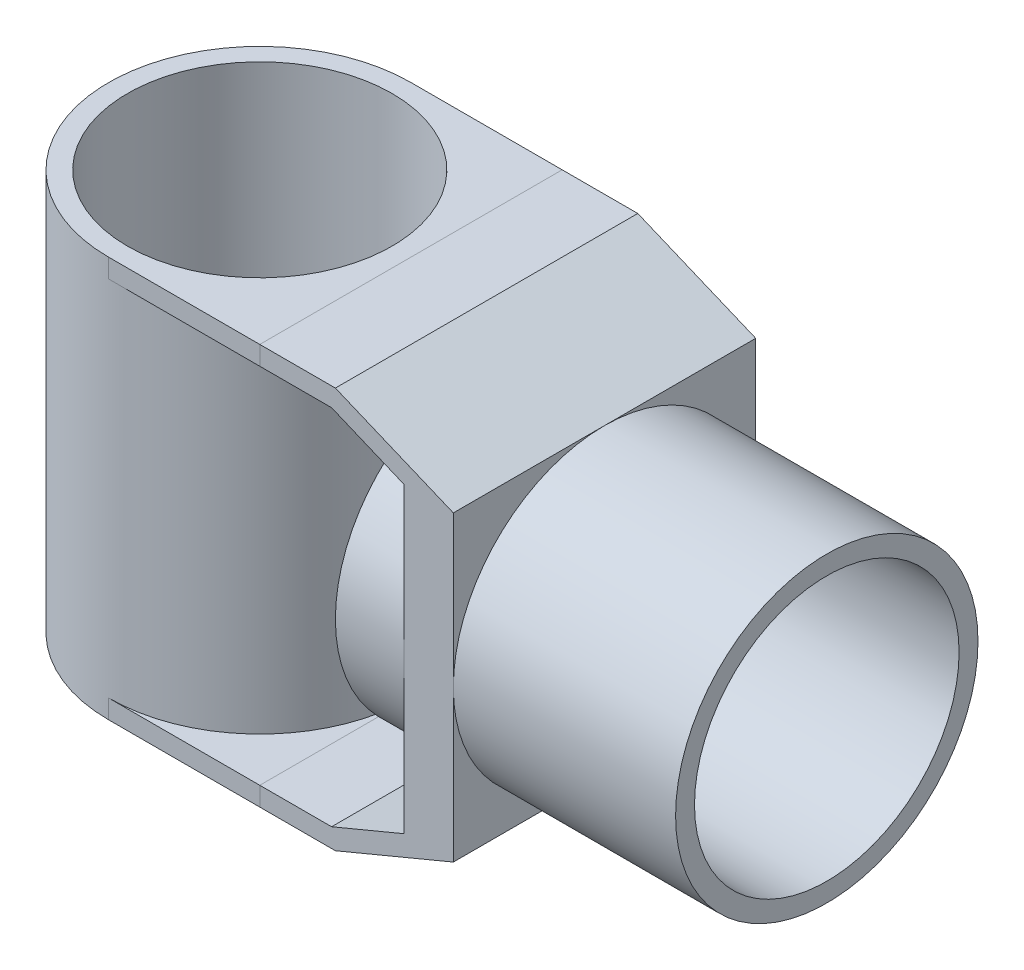
ISO-10303-21;
HEADER;
FILE_DESCRIPTION(('STEP AP214'),'2;1');
FILE_NAME('part.step','',(''),(''),'','','');
FILE_SCHEMA(('AUTOMOTIVE_DESIGN { 1 0 10303 214 1 1 1 1 }'));
ENDSEC;
DATA;
#1=APPLICATION_CONTEXT('core data for automotive mechanical design processes');
#2=APPLICATION_PROTOCOL_DEFINITION('international standard','automotive_design',2000,#1);
#3=PRODUCT_CONTEXT('',#1,'mechanical');
#4=PRODUCT('Part','Part','',(#3));
#5=PRODUCT_RELATED_PRODUCT_CATEGORY('part','',(#4));
#6=PRODUCT_DEFINITION_FORMATION('','',#4);
#7=PRODUCT_DEFINITION_CONTEXT('part definition',#1,'design');
#8=PRODUCT_DEFINITION('design','',#6,#7);
#9=PRODUCT_DEFINITION_SHAPE('','',#8);
#10=(LENGTH_UNIT() NAMED_UNIT(*) SI_UNIT(.MILLI.,.METRE.));
#11=(NAMED_UNIT(*) PLANE_ANGLE_UNIT() SI_UNIT($,.RADIAN.));
#12=(NAMED_UNIT(*) SI_UNIT($,.STERADIAN.) SOLID_ANGLE_UNIT());
#13=UNCERTAINTY_MEASURE_WITH_UNIT(LENGTH_MEASURE(1.E-05),#10,'distance_accuracy_value','');
#14=(GEOMETRIC_REPRESENTATION_CONTEXT(3) GLOBAL_UNCERTAINTY_ASSIGNED_CONTEXT((#13)) GLOBAL_UNIT_ASSIGNED_CONTEXT((#10,
#11,#12)) REPRESENTATION_CONTEXT('',''));
#15=CARTESIAN_POINT('',(0.,0.,0.));
#16=DIRECTION('',(0.,0.,1.));
#17=DIRECTION('',(1.,0.,0.));
#18=AXIS2_PLACEMENT_3D('',#15,#16,#17);
#19=CARTESIAN_POINT('',(180.,0.,0.));
#20=DIRECTION('',(-1.,0.,0.));
#21=DIRECTION('',(0.,0.,1.));
#22=AXIS2_PLACEMENT_3D('',#19,#20,#21);
#23=CYLINDRICAL_SURFACE('',#22,80.);
#24=CARTESIAN_POINT('',(0.,0.,0.));
#25=DIRECTION('',(-1.,0.,0.));
#26=DIRECTION('',(0.,0.,1.));
#27=AXIS2_PLACEMENT_3D('',#24,#25,#26);
#28=CIRCLE('',#27,80.);
#29=CARTESIAN_POINT('',(0.,0.,80.));
#30=VERTEX_POINT('',#29);
#31=EDGE_CURVE('E295',#30,#30,#28,.T.);
#32=ORIENTED_EDGE('',*,*,#31,.F.);
#33=EDGE_LOOP('',(#32));
#34=FACE_BOUND('',#33,.T.);
#35=CARTESIAN_POINT('',(36.4000000000002,0.,0.));
#36=DIRECTION('',(1.,0.,0.));
#37=DIRECTION('',(0.,1.,0.));
#38=AXIS2_PLACEMENT_3D('',#35,#36,#37);
#39=CIRCLE('',#38,80.);
#40=CARTESIAN_POINT('',(36.4000000000002,80.,0.));
#41=VERTEX_POINT('',#40);
#42=CARTESIAN_POINT('',(36.4000000000002,0.,80.));
#43=VERTEX_POINT('',#42);
#44=EDGE_CURVE('E189',#41,#43,#39,.T.);
#45=ORIENTED_EDGE('',*,*,#44,.F.);
#46=CARTESIAN_POINT('',(36.4000000000002,0.,0.));
#47=DIRECTION('',(1.,0.,0.));
#48=DIRECTION('',(0.,1.,0.));
#49=AXIS2_PLACEMENT_3D('',#46,#47,#48);
#50=CIRCLE('',#49,80.);
#51=CARTESIAN_POINT('',(36.4000000000002,0.,-80.));
#52=VERTEX_POINT('',#51);
#53=EDGE_CURVE('E182',#52,#41,#50,.T.);
#54=ORIENTED_EDGE('',*,*,#53,.F.);
#55=CARTESIAN_POINT('',(36.4000000000002,0.,0.));
#56=DIRECTION('',(1.,0.,0.));
#57=DIRECTION('',(0.,0.,-1.));
#58=AXIS2_PLACEMENT_3D('',#55,#56,#57);
#59=CIRCLE('',#58,80.);
#60=CARTESIAN_POINT('',(36.4000000000002,-80.,0.));
#61=VERTEX_POINT('',#60);
#62=EDGE_CURVE('E286',#61,#52,#59,.T.);
#63=ORIENTED_EDGE('',*,*,#62,.F.);
#64=CARTESIAN_POINT('',(36.4000000000002,0.,0.));
#65=DIRECTION('',(1.,0.,0.));
#66=DIRECTION('',(0.,0.,-1.));
#67=AXIS2_PLACEMENT_3D('',#64,#65,#66);
#68=CIRCLE('',#67,80.);
#69=EDGE_CURVE('E566',#43,#61,#68,.T.);
#70=ORIENTED_EDGE('',*,*,#69,.F.);
#71=EDGE_LOOP('',(#45,#54,#63,#70));
#72=FACE_BOUND('',#71,.T.);
#73=ADVANCED_FACE('F46',(#34,#72),#23,.T.);
#74=CARTESIAN_POINT('',(180.,0.,0.));
#75=DIRECTION('',(-1.,0.,0.));
#76=DIRECTION('',(0.,0.,1.));
#77=AXIS2_PLACEMENT_3D('',#74,#75,#76);
#78=CIRCLE('',#77,80.);
#79=CARTESIAN_POINT('',(180.,0.,80.));
#80=VERTEX_POINT('',#79);
#81=EDGE_CURVE('E298',#80,#80,#78,.T.);
#82=ORIENTED_EDGE('',*,*,#81,.T.);
#83=EDGE_LOOP('',(#82));
#84=FACE_BOUND('',#83,.T.);
#85=CARTESIAN_POINT('',(62.4000000000003,0.,0.));
#86=DIRECTION('',(-1.,0.,0.));
#87=DIRECTION('',(0.,0.,1.));
#88=AXIS2_PLACEMENT_3D('',#85,#86,#87);
#89=CIRCLE('',#88,80.);
#90=CARTESIAN_POINT('',(62.4000000000003,0.,-80.));
#91=VERTEX_POINT('',#90);
#92=CARTESIAN_POINT('',(62.4000000000003,-80.,0.));
#93=VERTEX_POINT('',#92);
#94=EDGE_CURVE('E279',#91,#93,#89,.T.);
#95=ORIENTED_EDGE('',*,*,#94,.F.);
#96=CARTESIAN_POINT('',(62.4000000000003,0.,0.));
#97=DIRECTION('',(-1.,0.,0.));
#98=DIRECTION('',(0.,-1.,0.));
#99=AXIS2_PLACEMENT_3D('',#96,#97,#98);
#100=CIRCLE('',#99,80.);
#101=CARTESIAN_POINT('',(62.4000000000003,80.,0.));
#102=VERTEX_POINT('',#101);
#103=EDGE_CURVE('E176',#102,#91,#100,.T.);
#104=ORIENTED_EDGE('',*,*,#103,.F.);
#105=CARTESIAN_POINT('',(62.4000000000003,0.,0.));
#106=DIRECTION('',(-1.,0.,0.));
#107=DIRECTION('',(0.,-1.,0.));
#108=AXIS2_PLACEMENT_3D('',#105,#106,#107);
#109=CIRCLE('',#108,80.);
#110=CARTESIAN_POINT('',(62.4000000000003,0.,80.));
#111=VERTEX_POINT('',#110);
#112=EDGE_CURVE('E116',#111,#102,#109,.T.);
#113=ORIENTED_EDGE('',*,*,#112,.F.);
#114=CARTESIAN_POINT('',(62.4000000000003,0.,0.));
#115=DIRECTION('',(-1.,0.,0.));
#116=DIRECTION('',(0.,0.,1.));
#117=AXIS2_PLACEMENT_3D('',#114,#115,#116);
#118=CIRCLE('',#117,80.);
#119=EDGE_CURVE('E244',#93,#111,#118,.T.);
#120=ORIENTED_EDGE('',*,*,#119,.F.);
#121=EDGE_LOOP('',(#95,#104,#113,#120));
#122=FACE_BOUND('',#121,.T.);
#123=ADVANCED_FACE('F318',(#84,#122),#23,.T.);
#124=CARTESIAN_POINT('',(-40.,106.,80.));
#125=DIRECTION('',(1.,0.,0.));
#126=DIRECTION('',(0.,0.,-1.));
#127=AXIS2_PLACEMENT_3D('',#124,#125,#126);
#128=PLANE('',#127);
#129=DIRECTION('',(0.,-1.,0.));
#130=VECTOR('',#129,1.);
#131=CARTESIAN_POINT('',(-40.,106.,-80.));
#132=LINE('',#131,#130);
#133=CARTESIAN_POINT('',(-40.,106.,-80.));
#134=VERTEX_POINT('',#133);
#135=CARTESIAN_POINT('',(-40.,96.,-80.));
#136=VERTEX_POINT('',#135);
#137=EDGE_CURVE('E140',#134,#136,#132,.T.);
#138=ORIENTED_EDGE('',*,*,#137,.T.);
#139=DIRECTION('',(0.,0.,-1.));
#140=VECTOR('',#139,1.);
#141=CARTESIAN_POINT('',(-40.,96.,80.));
#142=LINE('',#141,#140);
#143=CARTESIAN_POINT('',(-40.,96.,80.));
#144=VERTEX_POINT('',#143);
#145=EDGE_CURVE('E12',#144,#136,#142,.T.);
#146=ORIENTED_EDGE('',*,*,#145,.F.);
#147=DIRECTION('',(0.,-1.,0.));
#148=VECTOR('',#147,1.);
#149=CARTESIAN_POINT('',(-40.,106.,80.));
#150=LINE('',#149,#148);
#151=CARTESIAN_POINT('',(-40.,106.,80.));
#152=VERTEX_POINT('',#151);
#153=EDGE_CURVE('E149',#152,#144,#150,.T.);
#154=ORIENTED_EDGE('',*,*,#153,.F.);
#155=DIRECTION('',(0.,0.,-1.));
#156=VECTOR('',#155,1.);
#157=CARTESIAN_POINT('',(-40.,106.,80.));
#158=LINE('',#157,#156);
#159=EDGE_CURVE('E134',#152,#134,#158,.T.);
#160=ORIENTED_EDGE('',*,*,#159,.T.);
#161=EDGE_LOOP('',(#138,#146,#154,#160));
#162=FACE_BOUND('',#161,.T.);
#163=ADVANCED_FACE('F48',(#162),#128,.F.);
#164=CARTESIAN_POINT('',(-40.,96.,80.));
#165=DIRECTION('',(0.,1.,0.));
#166=DIRECTION('',(0.,0.,1.));
#167=AXIS2_PLACEMENT_3D('',#164,#165,#166);
#168=PLANE('',#167);
#169=DIRECTION('',(1.,0.,0.));
#170=VECTOR('',#169,1.);
#171=CARTESIAN_POINT('',(-40.,96.,-80.));
#172=LINE('',#171,#170);
#173=CARTESIAN_POINT('',(-1.99999999999999,96.,-80.));
#174=VERTEX_POINT('',#173);
#175=EDGE_CURVE('E143',#136,#174,#172,.T.);
#176=ORIENTED_EDGE('',*,*,#175,.T.);
#177=DIRECTION('',(0.,0.,-1.));
#178=VECTOR('',#177,1.);
#179=CARTESIAN_POINT('',(-1.99999999999999,96.,80.));
#180=LINE('',#179,#178);
#181=CARTESIAN_POINT('',(-1.99999999999999,96.,80.));
#182=VERTEX_POINT('',#181);
#183=EDGE_CURVE('E55',#182,#174,#180,.T.);
#184=ORIENTED_EDGE('',*,*,#183,.F.);
#185=DIRECTION('',(1.,0.,0.));
#186=VECTOR('',#185,1.);
#187=CARTESIAN_POINT('',(-40.,96.,80.));
#188=LINE('',#187,#186);
#189=EDGE_CURVE('E100',#144,#182,#188,.T.);
#190=ORIENTED_EDGE('',*,*,#189,.F.);
#191=ORIENTED_EDGE('',*,*,#145,.T.);
#192=EDGE_LOOP('',(#176,#184,#190,#191));
#193=FACE_BOUND('',#192,.T.);
#194=ADVANCED_FACE('F311',(#193),#168,.F.);
#195=CARTESIAN_POINT('',(-1.99999999999999,96.,80.));
#196=DIRECTION('',(0.384615384615383,0.923076923076924,0.));
#197=DIRECTION('',(-0.923076923076924,0.384615384615383,0.));
#198=AXIS2_PLACEMENT_3D('',#195,#196,#197);
#199=PLANE('',#198);
#200=DIRECTION('',(0.923076923076924,-0.384615384615384,0.));
#201=VECTOR('',#200,1.);
#202=CARTESIAN_POINT('',(-1.99999999999999,96.,-80.));
#203=LINE('',#202,#201);
#204=CARTESIAN_POINT('',(36.4000000000002,80.,-80.));
#205=VERTEX_POINT('',#204);
#206=EDGE_CURVE('E145',#174,#205,#203,.T.);
#207=ORIENTED_EDGE('',*,*,#206,.T.);
#208=DIRECTION('',(0.,0.,-1.));
#209=VECTOR('',#208,1.);
#210=CARTESIAN_POINT('',(36.4000000000002,80.,80.));
#211=LINE('',#210,#209);
#212=EDGE_CURVE('E119',#41,#205,#211,.T.);
#213=ORIENTED_EDGE('',*,*,#212,.F.);
#214=CARTESIAN_POINT('',(36.4000000000002,80.,80.));
#215=VERTEX_POINT('',#214);
#216=EDGE_CURVE('E152',#215,#41,#211,.T.);
#217=ORIENTED_EDGE('',*,*,#216,.F.);
#218=DIRECTION('',(0.923076923076924,-0.384615384615384,0.));
#219=VECTOR('',#218,1.);
#220=CARTESIAN_POINT('',(-1.99999999999999,96.,80.));
#221=LINE('',#220,#219);
#222=EDGE_CURVE('E132',#182,#215,#221,.T.);
#223=ORIENTED_EDGE('',*,*,#222,.F.);
#224=ORIENTED_EDGE('',*,*,#183,.T.);
#225=EDGE_LOOP('',(#207,#213,#217,#223,#224));
#226=FACE_BOUND('',#225,.T.);
#227=ADVANCED_FACE('F158',(#226),#199,.F.);
#228=CARTESIAN_POINT('',(0.,106.,80.));
#229=DIRECTION('',(-0.384615384615384,-0.923076923076923,0.));
#230=DIRECTION('',(0.923076923076924,-0.384615384615384,0.));
#231=AXIS2_PLACEMENT_3D('',#228,#229,#230);
#232=PLANE('',#231);
#233=DIRECTION('',(-0.923076923076923,0.384615384615384,0.));
#234=VECTOR('',#233,1.);
#235=CARTESIAN_POINT('',(0.,106.,-80.));
#236=LINE('',#235,#234);
#237=CARTESIAN_POINT('',(62.4000000000003,80.,-80.));
#238=VERTEX_POINT('',#237);
#239=CARTESIAN_POINT('',(0.,106.,-80.));
#240=VERTEX_POINT('',#239);
#241=EDGE_CURVE('E86',#238,#240,#236,.T.);
#242=ORIENTED_EDGE('',*,*,#241,.T.);
#243=DIRECTION('',(0.,0.,-1.));
#244=VECTOR('',#243,1.);
#245=CARTESIAN_POINT('',(0.,106.,80.));
#246=LINE('',#245,#244);
#247=CARTESIAN_POINT('',(0.,106.,80.));
#248=VERTEX_POINT('',#247);
#249=EDGE_CURVE('E131',#248,#240,#246,.T.);
#250=ORIENTED_EDGE('',*,*,#249,.F.);
#251=DIRECTION('',(-0.923076923076923,0.384615384615384,0.));
#252=VECTOR('',#251,1.);
#253=CARTESIAN_POINT('',(0.,106.,80.));
#254=LINE('',#253,#252);
#255=CARTESIAN_POINT('',(62.4000000000003,80.,80.));
#256=VERTEX_POINT('',#255);
#257=EDGE_CURVE('E124',#256,#248,#254,.T.);
#258=ORIENTED_EDGE('',*,*,#257,.F.);
#259=DIRECTION('',(0.,0.,-1.));
#260=VECTOR('',#259,1.);
#261=CARTESIAN_POINT('',(62.4000000000003,80.,80.));
#262=LINE('',#261,#260);
#263=EDGE_CURVE('E109',#256,#102,#262,.T.);
#264=ORIENTED_EDGE('',*,*,#263,.T.);
#265=EDGE_CURVE('E120',#102,#238,#262,.T.);
#266=ORIENTED_EDGE('',*,*,#265,.T.);
#267=EDGE_LOOP('',(#242,#250,#258,#264,#266));
#268=FACE_BOUND('',#267,.T.);
#269=ADVANCED_FACE('F130',(#268),#232,.F.);
#270=CARTESIAN_POINT('',(-40.,106.,80.));
#271=DIRECTION('',(0.,-1.,0.));
#272=DIRECTION('',(0.,0.,-1.));
#273=AXIS2_PLACEMENT_3D('',#270,#271,#272);
#274=PLANE('',#273);
#275=DIRECTION('',(-1.,0.,0.));
#276=VECTOR('',#275,1.);
#277=CARTESIAN_POINT('',(-40.,106.,-80.));
#278=LINE('',#277,#276);
#279=EDGE_CURVE('E92',#240,#134,#278,.T.);
#280=ORIENTED_EDGE('',*,*,#279,.T.);
#281=ORIENTED_EDGE('',*,*,#159,.F.);
#282=DIRECTION('',(-1.,0.,0.));
#283=VECTOR('',#282,1.);
#284=CARTESIAN_POINT('',(-40.,106.,80.));
#285=LINE('',#284,#283);
#286=EDGE_CURVE('E63',#248,#152,#285,.T.);
#287=ORIENTED_EDGE('',*,*,#286,.F.);
#288=ORIENTED_EDGE('',*,*,#249,.T.);
#289=EDGE_LOOP('',(#280,#281,#287,#288));
#290=FACE_BOUND('',#289,.T.);
#291=ADVANCED_FACE('F340',(#290),#274,.F.);
#292=CARTESIAN_POINT('',(0.,0.,80.));
#293=DIRECTION('',(0.,0.,1.));
#294=DIRECTION('',(1.,0.,0.));
#295=AXIS2_PLACEMENT_3D('',#292,#293,#294);
#296=PLANE('',#295);
#297=ORIENTED_EDGE('',*,*,#153,.T.);
#298=ORIENTED_EDGE('',*,*,#189,.T.);
#299=ORIENTED_EDGE('',*,*,#222,.T.);
#300=DIRECTION('',(0.,1.,0.));
#301=VECTOR('',#300,1.);
#302=CARTESIAN_POINT('',(36.4000000000003,-106.002,80.));
#303=LINE('',#302,#301);
#304=EDGE_CURVE('E128',#43,#215,#303,.T.);
#305=ORIENTED_EDGE('',*,*,#304,.F.);
#306=DIRECTION('',(0.,-1.,0.));
#307=VECTOR('',#306,1.);
#308=CARTESIAN_POINT('',(36.4000000000002,80.002,80.));
#309=LINE('',#308,#307);
#310=CARTESIAN_POINT('',(36.4000000000002,-80.,80.));
#311=VERTEX_POINT('',#310);
#312=EDGE_CURVE('E245',#43,#311,#309,.T.);
#313=ORIENTED_EDGE('',*,*,#312,.T.);
#314=DIRECTION('',(-0.923076923076924,-0.384615384615383,0.));
#315=VECTOR('',#314,1.);
#316=CARTESIAN_POINT('',(-1.99999999999999,-96.,80.));
#317=LINE('',#316,#315);
#318=CARTESIAN_POINT('',(-1.99999999999999,-96.,80.));
#319=VERTEX_POINT('',#318);
#320=EDGE_CURVE('E570',#311,#319,#317,.T.);
#321=ORIENTED_EDGE('',*,*,#320,.T.);
#322=DIRECTION('',(-1.,0.,0.));
#323=VECTOR('',#322,1.);
#324=CARTESIAN_POINT('',(-40.,-96.,80.));
#325=LINE('',#324,#323);
#326=CARTESIAN_POINT('',(-40.,-96.,80.));
#327=VERTEX_POINT('',#326);
#328=EDGE_CURVE('E572',#319,#327,#325,.T.);
#329=ORIENTED_EDGE('',*,*,#328,.T.);
#330=DIRECTION('',(0.,-1.,0.));
#331=VECTOR('',#330,1.);
#332=CARTESIAN_POINT('',(-40.,-106.,80.));
#333=LINE('',#332,#331);
#334=CARTESIAN_POINT('',(-40.,-106.,80.));
#335=VERTEX_POINT('',#334);
#336=EDGE_CURVE('E574',#327,#335,#333,.T.);
#337=ORIENTED_EDGE('',*,*,#336,.T.);
#338=DIRECTION('',(1.,0.,0.));
#339=VECTOR('',#338,1.);
#340=CARTESIAN_POINT('',(-40.,-106.,80.));
#341=LINE('',#340,#339);
#342=CARTESIAN_POINT('',(0.,-106.,80.));
#343=VERTEX_POINT('',#342);
#344=EDGE_CURVE('E250',#335,#343,#341,.T.);
#345=ORIENTED_EDGE('',*,*,#344,.T.);
#346=DIRECTION('',(0.923076923076924,0.384615384615383,0.));
#347=VECTOR('',#346,1.);
#348=CARTESIAN_POINT('',(0.,-106.,80.));
#349=LINE('',#348,#347);
#350=CARTESIAN_POINT('',(62.4000000000003,-80.,80.));
#351=VERTEX_POINT('',#350);
#352=EDGE_CURVE('E248',#343,#351,#349,.T.);
#353=ORIENTED_EDGE('',*,*,#352,.T.);
#354=DIRECTION('',(0.,-1.,0.));
#355=VECTOR('',#354,1.);
#356=CARTESIAN_POINT('',(62.4000000000003,80.002,80.));
#357=LINE('',#356,#355);
#358=EDGE_CURVE('E127',#111,#351,#357,.T.);
#359=ORIENTED_EDGE('',*,*,#358,.F.);
#360=DIRECTION('',(0.,1.,0.));
#361=VECTOR('',#360,1.);
#362=CARTESIAN_POINT('',(62.4000000000004,-106.002,80.));
#363=LINE('',#362,#361);
#364=EDGE_CURVE('E113',#111,#256,#363,.T.);
#365=ORIENTED_EDGE('',*,*,#364,.T.);
#366=ORIENTED_EDGE('',*,*,#257,.T.);
#367=ORIENTED_EDGE('',*,*,#286,.T.);
#368=EDGE_LOOP('',(#297,#298,#299,#305,#313,#321,#329,#337,#345,#353,#359,#365,#366,#367));
#369=FACE_BOUND('',#368,.T.);
#370=ADVANCED_FACE('F123',(#369),#296,.T.);
#371=CARTESIAN_POINT('',(0.,0.,-80.));
#372=DIRECTION('',(0.,0.,1.));
#373=DIRECTION('',(1.,0.,0.));
#374=AXIS2_PLACEMENT_3D('',#371,#372,#373);
#375=PLANE('',#374);
#376=ORIENTED_EDGE('',*,*,#137,.F.);
#377=ORIENTED_EDGE('',*,*,#279,.F.);
#378=ORIENTED_EDGE('',*,*,#241,.F.);
#379=DIRECTION('',(0.,1.,0.));
#380=VECTOR('',#379,1.);
#381=CARTESIAN_POINT('',(62.4000000000004,-106.002,-80.));
#382=LINE('',#381,#380);
#383=EDGE_CURVE('E177',#91,#238,#382,.T.);
#384=ORIENTED_EDGE('',*,*,#383,.F.);
#385=DIRECTION('',(0.,-1.,0.));
#386=VECTOR('',#385,1.);
#387=CARTESIAN_POINT('',(62.4000000000003,80.002,-80.));
#388=LINE('',#387,#386);
#389=CARTESIAN_POINT('',(62.4000000000003,-80.,-80.));
#390=VERTEX_POINT('',#389);
#391=EDGE_CURVE('E283',#91,#390,#388,.T.);
#392=ORIENTED_EDGE('',*,*,#391,.T.);
#393=DIRECTION('',(0.923076923076924,0.384615384615383,0.));
#394=VECTOR('',#393,1.);
#395=CARTESIAN_POINT('',(0.,-106.,-80.));
#396=LINE('',#395,#394);
#397=CARTESIAN_POINT('',(0.,-106.,-80.));
#398=VERTEX_POINT('',#397);
#399=EDGE_CURVE('E265',#398,#390,#396,.T.);
#400=ORIENTED_EDGE('',*,*,#399,.F.);
#401=DIRECTION('',(1.,0.,0.));
#402=VECTOR('',#401,1.);
#403=CARTESIAN_POINT('',(-40.,-106.,-80.));
#404=LINE('',#403,#402);
#405=CARTESIAN_POINT('',(-40.,-106.,-80.));
#406=VERTEX_POINT('',#405);
#407=EDGE_CURVE('E581',#406,#398,#404,.T.);
#408=ORIENTED_EDGE('',*,*,#407,.F.);
#409=DIRECTION('',(0.,-1.,0.));
#410=VECTOR('',#409,1.);
#411=CARTESIAN_POINT('',(-40.,-106.,-80.));
#412=LINE('',#411,#410);
#413=CARTESIAN_POINT('',(-40.,-96.,-80.));
#414=VERTEX_POINT('',#413);
#415=EDGE_CURVE('E580',#414,#406,#412,.T.);
#416=ORIENTED_EDGE('',*,*,#415,.F.);
#417=DIRECTION('',(-1.,0.,0.));
#418=VECTOR('',#417,1.);
#419=CARTESIAN_POINT('',(-40.,-96.,-80.));
#420=LINE('',#419,#418);
#421=CARTESIAN_POINT('',(-1.99999999999999,-96.,-80.));
#422=VERTEX_POINT('',#421);
#423=EDGE_CURVE('E578',#422,#414,#420,.T.);
#424=ORIENTED_EDGE('',*,*,#423,.F.);
#425=DIRECTION('',(-0.923076923076924,-0.384615384615383,0.));
#426=VECTOR('',#425,1.);
#427=CARTESIAN_POINT('',(-1.99999999999999,-96.,-80.));
#428=LINE('',#427,#426);
#429=CARTESIAN_POINT('',(36.4000000000002,-80.,-80.));
#430=VERTEX_POINT('',#429);
#431=EDGE_CURVE('E565',#430,#422,#428,.T.);
#432=ORIENTED_EDGE('',*,*,#431,.F.);
#433=DIRECTION('',(0.,-1.,0.));
#434=VECTOR('',#433,1.);
#435=CARTESIAN_POINT('',(36.4000000000002,80.002,-80.));
#436=LINE('',#435,#434);
#437=EDGE_CURVE('E172',#52,#430,#436,.T.);
#438=ORIENTED_EDGE('',*,*,#437,.F.);
#439=DIRECTION('',(0.,1.,0.));
#440=VECTOR('',#439,1.);
#441=CARTESIAN_POINT('',(36.4000000000003,-106.002,-80.));
#442=LINE('',#441,#440);
#443=EDGE_CURVE('E167',#52,#205,#442,.T.);
#444=ORIENTED_EDGE('',*,*,#443,.T.);
#445=ORIENTED_EDGE('',*,*,#206,.F.);
#446=ORIENTED_EDGE('',*,*,#175,.F.);
#447=EDGE_LOOP('',(#376,#377,#378,#384,#392,#400,#408,#416,#424,#432,#438,#444,#445,#446));
#448=FACE_BOUND('',#447,.T.);
#449=ADVANCED_FACE('F164',(#448),#375,.F.);
#450=CARTESIAN_POINT('',(36.4000000000003,-106.002,80.));
#451=DIRECTION('',(1.,0.,0.));
#452=DIRECTION('',(0.,1.,0.));
#453=AXIS2_PLACEMENT_3D('',#450,#451,#452);
#454=PLANE('',#453);
#455=ORIENTED_EDGE('',*,*,#216,.T.);
#456=ORIENTED_EDGE('',*,*,#44,.T.);
#457=ORIENTED_EDGE('',*,*,#304,.T.);
#458=EDGE_LOOP('',(#455,#456,#457));
#459=FACE_BOUND('',#458,.T.);
#460=ADVANCED_FACE('F331',(#459),#454,.F.);
#461=CARTESIAN_POINT('',(62.4000000000004,-106.002,-80.));
#462=DIRECTION('',(-1.,0.,0.));
#463=DIRECTION('',(0.,-1.,0.));
#464=AXIS2_PLACEMENT_3D('',#461,#462,#463);
#465=PLANE('',#464);
#466=ORIENTED_EDGE('',*,*,#364,.F.);
#467=ORIENTED_EDGE('',*,*,#112,.T.);
#468=ORIENTED_EDGE('',*,*,#263,.F.);
#469=EDGE_LOOP('',(#466,#467,#468));
#470=FACE_BOUND('',#469,.T.);
#471=ADVANCED_FACE('F111',(#470),#465,.F.);
#472=CARTESIAN_POINT('',(180.,0.,0.));
#473=DIRECTION('',(-1.,0.,0.));
#474=DIRECTION('',(0.,0.,1.));
#475=AXIS2_PLACEMENT_3D('',#472,#473,#474);
#476=PLANE('',#475);
#477=CARTESIAN_POINT('',(180.,0.,0.));
#478=DIRECTION('',(-1.,0.,0.));
#479=DIRECTION('',(0.,0.,1.));
#480=AXIS2_PLACEMENT_3D('',#477,#478,#479);
#481=CIRCLE('',#480,70.0000000000001);
#482=CARTESIAN_POINT('',(180.,0.,70.0000000000001));
#483=VERTEX_POINT('',#482);
#484=EDGE_CURVE('E292',#483,#483,#481,.T.);
#485=ORIENTED_EDGE('',*,*,#484,.T.);
#486=EDGE_LOOP('',(#485));
#487=FACE_BOUND('',#486,.T.);
#488=ORIENTED_EDGE('',*,*,#81,.F.);
#489=EDGE_LOOP('',(#488));
#490=FACE_BOUND('',#489,.T.);
#491=ADVANCED_FACE('F337',(#487,#490),#476,.F.);
#492=CARTESIAN_POINT('',(0.,0.,0.));
#493=DIRECTION('',(-1.,0.,0.));
#494=DIRECTION('',(0.,0.,1.));
#495=AXIS2_PLACEMENT_3D('',#492,#493,#494);
#496=PLANE('',#495);
#497=CARTESIAN_POINT('',(0.,0.,0.));
#498=DIRECTION('',(-1.,0.,0.));
#499=DIRECTION('',(0.,0.,1.));
#500=AXIS2_PLACEMENT_3D('',#497,#498,#499);
#501=CIRCLE('',#500,70.0000000000001);
#502=CARTESIAN_POINT('',(0.,0.,70.0000000000001));
#503=VERTEX_POINT('',#502);
#504=EDGE_CURVE('E289',#503,#503,#501,.T.);
#505=ORIENTED_EDGE('',*,*,#504,.F.);
#506=EDGE_LOOP('',(#505));
#507=FACE_BOUND('',#506,.T.);
#508=ORIENTED_EDGE('',*,*,#31,.T.);
#509=EDGE_LOOP('',(#508));
#510=FACE_BOUND('',#509,.T.);
#511=ADVANCED_FACE('F329',(#507,#510),#496,.T.);
#512=CARTESIAN_POINT('',(180.,0.,0.));
#513=DIRECTION('',(-1.,0.,0.));
#514=DIRECTION('',(0.,0.,1.));
#515=AXIS2_PLACEMENT_3D('',#512,#513,#514);
#516=CYLINDRICAL_SURFACE('',#515,70.0000000000001);
#517=CARTESIAN_POINT('',(180.,0.,70.0000000000001));
#518=CARTESIAN_POINT('',(178.125,0.,70.0000000000001));
#519=CARTESIAN_POINT('',(176.25,0.,70.0000000000001));
#520=CARTESIAN_POINT('',(172.5,0.,70.0000000000001));
#521=CARTESIAN_POINT('',(170.625,0.,70.0000000000001));
#522=CARTESIAN_POINT('',(166.875,0.,70.0000000000001));
#523=CARTESIAN_POINT('',(165.,0.,70.0000000000001));
#524=CARTESIAN_POINT('',(161.25,0.,70.0000000000001));
#525=CARTESIAN_POINT('',(159.375,0.,70.0000000000001));
#526=CARTESIAN_POINT('',(155.625,0.,70.0000000000001));
#527=CARTESIAN_POINT('',(153.75,0.,70.0000000000001));
#528=CARTESIAN_POINT('',(150.,0.,70.0000000000001));
#529=CARTESIAN_POINT('',(148.125,0.,70.0000000000001));
#530=CARTESIAN_POINT('',(144.375,0.,70.0000000000001));
#531=CARTESIAN_POINT('',(142.5,0.,70.0000000000001));
#532=CARTESIAN_POINT('',(138.75,0.,70.0000000000001));
#533=CARTESIAN_POINT('',(136.875,0.,70.0000000000001));
#534=CARTESIAN_POINT('',(133.125,0.,70.0000000000001));
#535=CARTESIAN_POINT('',(131.25,0.,70.0000000000001));
#536=CARTESIAN_POINT('',(127.5,0.,70.0000000000001));
#537=CARTESIAN_POINT('',(125.625,0.,70.0000000000001));
#538=CARTESIAN_POINT('',(121.875,0.,70.0000000000001));
#539=CARTESIAN_POINT('',(120.,0.,70.0000000000001));
#540=CARTESIAN_POINT('',(116.25,0.,70.0000000000001));
#541=CARTESIAN_POINT('',(114.375,0.,70.0000000000001));
#542=CARTESIAN_POINT('',(110.625,0.,70.0000000000001));
#543=CARTESIAN_POINT('',(108.75,0.,70.0000000000001));
#544=CARTESIAN_POINT('',(105.,0.,70.0000000000001));
#545=CARTESIAN_POINT('',(103.125,0.,70.0000000000001));
#546=CARTESIAN_POINT('',(99.375,0.,70.0000000000001));
#547=CARTESIAN_POINT('',(97.5,0.,70.0000000000001));
#548=CARTESIAN_POINT('',(93.75,0.,70.0000000000001));
#549=CARTESIAN_POINT('',(91.875,0.,70.0000000000001));
#550=CARTESIAN_POINT('',(88.125,0.,70.0000000000001));
#551=CARTESIAN_POINT('',(86.25,0.,70.0000000000001));
#552=CARTESIAN_POINT('',(82.5,0.,70.0000000000001));
#553=CARTESIAN_POINT('',(80.625,0.,70.0000000000001));
#554=CARTESIAN_POINT('',(76.875,0.,70.0000000000001));
#555=CARTESIAN_POINT('',(75.,0.,70.0000000000001));
#556=CARTESIAN_POINT('',(71.25,0.,70.0000000000001));
#557=CARTESIAN_POINT('',(69.375,0.,70.0000000000001));
#558=CARTESIAN_POINT('',(65.625,0.,70.0000000000001));
#559=CARTESIAN_POINT('',(63.75,0.,70.0000000000001));
#560=CARTESIAN_POINT('',(60.,0.,70.0000000000001));
#561=CARTESIAN_POINT('',(58.125,0.,70.0000000000001));
#562=CARTESIAN_POINT('',(54.375,0.,70.0000000000001));
#563=CARTESIAN_POINT('',(52.5,0.,70.0000000000001));
#564=CARTESIAN_POINT('',(48.75,0.,70.0000000000001));
#565=CARTESIAN_POINT('',(46.875,0.,70.0000000000001));
#566=CARTESIAN_POINT('',(43.125,0.,70.0000000000001));
#567=CARTESIAN_POINT('',(41.25,0.,70.0000000000001));
#568=CARTESIAN_POINT('',(37.5,0.,70.0000000000001));
#569=CARTESIAN_POINT('',(35.625,0.,70.0000000000001));
#570=CARTESIAN_POINT('',(31.875,0.,70.0000000000001));
#571=CARTESIAN_POINT('',(30.,0.,70.0000000000001));
#572=CARTESIAN_POINT('',(26.25,0.,70.0000000000001));
#573=CARTESIAN_POINT('',(24.375,0.,70.0000000000001));
#574=CARTESIAN_POINT('',(20.625,0.,70.0000000000001));
#575=CARTESIAN_POINT('',(18.75,0.,70.0000000000001));
#576=CARTESIAN_POINT('',(15.,0.,70.0000000000001));
#577=CARTESIAN_POINT('',(13.125,0.,70.0000000000001));
#578=CARTESIAN_POINT('',(9.37500000000003,0.,70.0000000000001));
#579=CARTESIAN_POINT('',(7.50000000000002,0.,70.0000000000001));
#580=CARTESIAN_POINT('',(3.75000000000002,0.,70.0000000000001));
#581=CARTESIAN_POINT('',(1.87500000000003,0.,70.0000000000001));
#582=CARTESIAN_POINT('',(0.,0.,70.0000000000001));
#583=B_SPLINE_CURVE_WITH_KNOTS('',3,(#517,#518,#519,#520,#521,#522,#523,#524,#525,#526,#527,
#528,#529,#530,#531,#532,#533,#534,#535,#536,#537,#538,#539,#540,#541,#542,#543,#544,#545,#546,
#547,#548,#549,#550,#551,#552,#553,#554,#555,#556,#557,#558,#559,#560,#561,#562,#563,#564,#565,
#566,#567,#568,#569,#570,#571,#572,#573,#574,#575,#576,#577,#578,#579,#580,#581,#582),
.UNSPECIFIED.,.F.,.F.,(4,2,2,2,2,2,2,2,2,2,2,2,2,2,2,2,2,2,2,2,2,2,2,2,2,2,2,2,2,2,2,2,4),(0.,
5.62499999999999,11.25,16.875,22.5,28.125,33.75,39.375,45.,50.625,56.25,61.875,67.5,73.125,
78.75,84.375,90.,95.625,101.25,106.875,112.5,118.125,123.75,129.375,135.,140.625,146.25,151.875,
157.5,163.125,168.75,174.375,180.),.UNSPECIFIED.);
#584=EDGE_CURVE('BSEAM382',#483,#503,#583,.T.);
#585=ORIENTED_EDGE('',*,*,#484,.F.);
#586=ORIENTED_EDGE('',*,*,#504,.T.);
#587=ORIENTED_EDGE('',*,*,#584,.T.);
#588=ORIENTED_EDGE('',*,*,#584,.F.);
#589=EDGE_LOOP('',(#585,#587,#586,#588));
#590=FACE_BOUND('',#589,.T.);
#591=ADVANCED_FACE('F382',(#590),#516,.F.);
#592=CARTESIAN_POINT('',(36.4000000000002,80.002,-80.));
#593=DIRECTION('',(1.,0.,0.));
#594=DIRECTION('',(0.,0.,-1.));
#595=AXIS2_PLACEMENT_3D('',#592,#593,#594);
#596=PLANE('',#595);
#597=DIRECTION('',(0.,0.,1.));
#598=VECTOR('',#597,1.);
#599=CARTESIAN_POINT('',(36.4000000000002,-80.,-80.));
#600=LINE('',#599,#598);
#601=EDGE_CURVE('E280',#430,#61,#600,.T.);
#602=ORIENTED_EDGE('',*,*,#601,.T.);
#603=ORIENTED_EDGE('',*,*,#62,.T.);
#604=ORIENTED_EDGE('',*,*,#437,.T.);
#605=EDGE_LOOP('',(#602,#603,#604));
#606=FACE_BOUND('',#605,.T.);
#607=ADVANCED_FACE('F389',(#606),#596,.F.);
#608=CARTESIAN_POINT('',(62.4000000000003,80.002,80.));
#609=DIRECTION('',(-1.,0.,0.));
#610=DIRECTION('',(0.,0.,1.));
#611=AXIS2_PLACEMENT_3D('',#608,#609,#610);
#612=PLANE('',#611);
#613=ORIENTED_EDGE('',*,*,#391,.F.);
#614=ORIENTED_EDGE('',*,*,#94,.T.);
#615=DIRECTION('',(0.,0.,-1.));
#616=VECTOR('',#615,1.);
#617=CARTESIAN_POINT('',(62.4000000000003,-80.,80.));
#618=LINE('',#617,#616);
#619=EDGE_CURVE('E258',#93,#390,#618,.T.);
#620=ORIENTED_EDGE('',*,*,#619,.T.);
#621=EDGE_LOOP('',(#613,#614,#620));
#622=FACE_BOUND('',#621,.T.);
#623=ADVANCED_FACE('F397',(#622),#612,.F.);
#624=CARTESIAN_POINT('',(-1.99999999999999,-96.,80.));
#625=DIRECTION('',(0.384615384615383,-0.923076923076924,0.));
#626=DIRECTION('',(0.923076923076924,0.384615384615383,0.));
#627=AXIS2_PLACEMENT_3D('',#624,#625,#626);
#628=PLANE('',#627);
#629=ORIENTED_EDGE('',*,*,#431,.T.);
#630=DIRECTION('',(0.,0.,-1.));
#631=VECTOR('',#630,1.);
#632=CARTESIAN_POINT('',(-1.99999999999999,-96.,80.));
#633=LINE('',#632,#631);
#634=EDGE_CURVE('E273',#319,#422,#633,.T.);
#635=ORIENTED_EDGE('',*,*,#634,.F.);
#636=ORIENTED_EDGE('',*,*,#320,.F.);
#637=DIRECTION('',(0.,0.,-1.));
#638=VECTOR('',#637,1.);
#639=CARTESIAN_POINT('',(36.4000000000002,-80.,80.));
#640=LINE('',#639,#638);
#641=EDGE_CURVE('E276',#311,#61,#640,.T.);
#642=ORIENTED_EDGE('',*,*,#641,.T.);
#643=ORIENTED_EDGE('',*,*,#601,.F.);
#644=EDGE_LOOP('',(#629,#635,#636,#642,#643));
#645=FACE_BOUND('',#644,.T.);
#646=ADVANCED_FACE('F405',(#645),#628,.F.);
#647=CARTESIAN_POINT('',(-40.,-96.,80.));
#648=DIRECTION('',(0.,-1.,0.));
#649=DIRECTION('',(0.,0.,-1.));
#650=AXIS2_PLACEMENT_3D('',#647,#648,#649);
#651=PLANE('',#650);
#652=ORIENTED_EDGE('',*,*,#423,.T.);
#653=DIRECTION('',(0.,0.,-1.));
#654=VECTOR('',#653,1.);
#655=CARTESIAN_POINT('',(-40.,-96.,80.));
#656=LINE('',#655,#654);
#657=EDGE_CURVE('E270',#327,#414,#656,.T.);
#658=ORIENTED_EDGE('',*,*,#657,.F.);
#659=ORIENTED_EDGE('',*,*,#328,.F.);
#660=ORIENTED_EDGE('',*,*,#634,.T.);
#661=EDGE_LOOP('',(#652,#658,#659,#660));
#662=FACE_BOUND('',#661,.T.);
#663=ADVANCED_FACE('F413',(#662),#651,.F.);
#664=CARTESIAN_POINT('',(-40.,-106.,80.));
#665=DIRECTION('',(1.,0.,0.));
#666=DIRECTION('',(0.,0.,-1.));
#667=AXIS2_PLACEMENT_3D('',#664,#665,#666);
#668=PLANE('',#667);
#669=ORIENTED_EDGE('',*,*,#415,.T.);
#670=DIRECTION('',(0.,0.,-1.));
#671=VECTOR('',#670,1.);
#672=CARTESIAN_POINT('',(-40.,-106.,80.));
#673=LINE('',#672,#671);
#674=EDGE_CURVE('E262',#335,#406,#673,.T.);
#675=ORIENTED_EDGE('',*,*,#674,.F.);
#676=ORIENTED_EDGE('',*,*,#336,.F.);
#677=ORIENTED_EDGE('',*,*,#657,.T.);
#678=EDGE_LOOP('',(#669,#675,#676,#677));
#679=FACE_BOUND('',#678,.T.);
#680=ADVANCED_FACE('F421',(#679),#668,.F.);
#681=CARTESIAN_POINT('',(-40.,-106.,80.));
#682=DIRECTION('',(0.,1.,0.));
#683=DIRECTION('',(0.,0.,1.));
#684=AXIS2_PLACEMENT_3D('',#681,#682,#683);
#685=PLANE('',#684);
#686=ORIENTED_EDGE('',*,*,#407,.T.);
#687=DIRECTION('',(0.,0.,-1.));
#688=VECTOR('',#687,1.);
#689=CARTESIAN_POINT('',(0.,-106.,80.));
#690=LINE('',#689,#688);
#691=EDGE_CURVE('E260',#343,#398,#690,.T.);
#692=ORIENTED_EDGE('',*,*,#691,.F.);
#693=ORIENTED_EDGE('',*,*,#344,.F.);
#694=ORIENTED_EDGE('',*,*,#674,.T.);
#695=EDGE_LOOP('',(#686,#692,#693,#694));
#696=FACE_BOUND('',#695,.T.);
#697=ADVANCED_FACE('F429',(#696),#685,.F.);
#698=CARTESIAN_POINT('',(0.,-106.,80.));
#699=DIRECTION('',(-0.384615384615383,0.923076923076924,0.));
#700=DIRECTION('',(-0.923076923076924,-0.384615384615383,0.));
#701=AXIS2_PLACEMENT_3D('',#698,#699,#700);
#702=PLANE('',#701);
#703=ORIENTED_EDGE('',*,*,#399,.T.);
#704=ORIENTED_EDGE('',*,*,#619,.F.);
#705=DIRECTION('',(0.,0.,-1.));
#706=VECTOR('',#705,1.);
#707=CARTESIAN_POINT('',(62.4000000000003,-80.,80.));
#708=LINE('',#707,#706);
#709=EDGE_CURVE('E242',#351,#93,#708,.T.);
#710=ORIENTED_EDGE('',*,*,#709,.F.);
#711=ORIENTED_EDGE('',*,*,#352,.F.);
#712=ORIENTED_EDGE('',*,*,#691,.T.);
#713=EDGE_LOOP('',(#703,#704,#710,#711,#712));
#714=FACE_BOUND('',#713,.T.);
#715=ADVANCED_FACE('F256',(#714),#702,.F.);
#716=CARTESIAN_POINT('',(36.4000000000002,80.002,-80.));
#717=DIRECTION('',(1.,0.,0.));
#718=DIRECTION('',(0.,0.,-1.));
#719=AXIS2_PLACEMENT_3D('',#716,#717,#718);
#720=PLANE('',#719);
#721=ORIENTED_EDGE('',*,*,#312,.F.);
#722=ORIENTED_EDGE('',*,*,#69,.T.);
#723=ORIENTED_EDGE('',*,*,#641,.F.);
#724=EDGE_LOOP('',(#721,#722,#723));
#725=FACE_BOUND('',#724,.T.);
#726=ADVANCED_FACE('F444',(#725),#720,.F.);
#727=CARTESIAN_POINT('',(62.4000000000003,80.002,80.));
#728=DIRECTION('',(-1.,0.,0.));
#729=DIRECTION('',(0.,0.,1.));
#730=AXIS2_PLACEMENT_3D('',#727,#728,#729);
#731=PLANE('',#730);
#732=ORIENTED_EDGE('',*,*,#709,.T.);
#733=ORIENTED_EDGE('',*,*,#119,.T.);
#734=ORIENTED_EDGE('',*,*,#358,.T.);
#735=EDGE_LOOP('',(#732,#733,#734));
#736=FACE_BOUND('',#735,.T.);
#737=ADVANCED_FACE('F240',(#736),#731,.F.);
#738=CARTESIAN_POINT('',(36.4000000000003,-106.002,80.));
#739=DIRECTION('',(1.,0.,0.));
#740=DIRECTION('',(0.,1.,0.));
#741=AXIS2_PLACEMENT_3D('',#738,#739,#740);
#742=PLANE('',#741);
#743=ORIENTED_EDGE('',*,*,#443,.F.);
#744=ORIENTED_EDGE('',*,*,#53,.T.);
#745=ORIENTED_EDGE('',*,*,#212,.T.);
#746=EDGE_LOOP('',(#743,#744,#745));
#747=FACE_BOUND('',#746,.T.);
#748=ADVANCED_FACE('F179',(#747),#742,.F.);
#749=CARTESIAN_POINT('',(62.4000000000004,-106.002,-80.));
#750=DIRECTION('',(-1.,0.,0.));
#751=DIRECTION('',(0.,-1.,0.));
#752=AXIS2_PLACEMENT_3D('',#749,#750,#751);
#753=PLANE('',#752);
#754=ORIENTED_EDGE('',*,*,#265,.F.);
#755=ORIENTED_EDGE('',*,*,#103,.T.);
#756=ORIENTED_EDGE('',*,*,#383,.T.);
#757=EDGE_LOOP('',(#754,#755,#756));
#758=FACE_BOUND('',#757,.T.);
#759=ADVANCED_FACE('F464',(#758),#753,.F.);
#760=CLOSED_SHELL('',(#73,#123,#163,#194,#227,#269,#291,#370,#449,#460,#471,#491,#511,#591,#607,
#623,#646,#663,#680,#697,#715,#726,#737,#748,#759));
#761=MANIFOLD_SOLID_BREP('B2',#760);
#762=CARTESIAN_POINT('',(-120.,106.,0.));
#763=DIRECTION('',(0.,-1.,0.));
#764=DIRECTION('',(0.,0.,-1.));
#765=AXIS2_PLACEMENT_3D('',#762,#763,#764);
#766=CYLINDRICAL_SURFACE('',#765,80.);
#767=DIRECTION('',(0.,-1.,0.));
#768=VECTOR('',#767,1.);
#769=CARTESIAN_POINT('',(-120.,106.,80.));
#770=LINE('',#769,#768);
#771=CARTESIAN_POINT('',(-120.,-106.,80.));
#772=VERTEX_POINT('',#771);
#773=CARTESIAN_POINT('',(-120.,-96.,80.));
#774=VERTEX_POINT('',#773);
#775=EDGE_CURVE('E617',#772,#774,#770,.F.);
#776=ORIENTED_EDGE('',*,*,#775,.T.);
#777=CARTESIAN_POINT('',(-120.,-96.,0.));
#778=DIRECTION('',(0.,-1.,0.));
#779=DIRECTION('',(0.,0.,-1.));
#780=AXIS2_PLACEMENT_3D('',#777,#778,#779);
#781=CIRCLE('',#780,80.);
#782=CARTESIAN_POINT('',(-40.,-96.,0.));
#783=VERTEX_POINT('',#782);
#784=EDGE_CURVE('E713',#774,#783,#781,.F.);
#785=ORIENTED_EDGE('',*,*,#784,.T.);
#786=CARTESIAN_POINT('',(-120.,-96.,0.));
#787=DIRECTION('',(0.,-1.,0.));
#788=DIRECTION('',(0.,0.,-1.));
#789=AXIS2_PLACEMENT_3D('',#786,#787,#788);
#790=CIRCLE('',#789,80.);
#791=CARTESIAN_POINT('',(-120.,-96.,-80.));
#792=VERTEX_POINT('',#791);
#793=EDGE_CURVE('E740',#783,#792,#790,.F.);
#794=ORIENTED_EDGE('',*,*,#793,.T.);
#795=DIRECTION('',(0.,-1.,0.));
#796=VECTOR('',#795,1.);
#797=CARTESIAN_POINT('',(-120.,106.,-80.));
#798=LINE('',#797,#796);
#799=CARTESIAN_POINT('',(-120.,-106.,-80.));
#800=VERTEX_POINT('',#799);
#801=EDGE_CURVE('E739',#800,#792,#798,.F.);
#802=ORIENTED_EDGE('',*,*,#801,.F.);
#803=CARTESIAN_POINT('',(-120.,-106.,0.));
#804=DIRECTION('',(0.,1.,0.));
#805=DIRECTION('',(0.,0.,1.));
#806=AXIS2_PLACEMENT_3D('',#803,#804,#805);
#807=CIRCLE('',#806,80.);
#808=EDGE_CURVE('E606',#800,#772,#807,.T.);
#809=ORIENTED_EDGE('',*,*,#808,.T.);
#810=EDGE_LOOP('',(#776,#785,#794,#802,#809));
#811=FACE_BOUND('',#810,.T.);
#812=CARTESIAN_POINT('',(-120.,106.,0.));
#813=DIRECTION('',(0.,1.,0.));
#814=DIRECTION('',(0.,0.,1.));
#815=AXIS2_PLACEMENT_3D('',#812,#813,#814);
#816=CIRCLE('',#815,80.);
#817=CARTESIAN_POINT('',(-120.,106.,-80.));
#818=VERTEX_POINT('',#817);
#819=CARTESIAN_POINT('',(-120.,106.,80.));
#820=VERTEX_POINT('',#819);
#821=EDGE_CURVE('E44',#818,#820,#816,.T.);
#822=ORIENTED_EDGE('',*,*,#821,.F.);
#823=DIRECTION('',(0.,-1.,0.));
#824=VECTOR('',#823,1.);
#825=CARTESIAN_POINT('',(-120.,106.,-80.));
#826=LINE('',#825,#824);
#827=CARTESIAN_POINT('',(-120.,96.,-80.));
#828=VERTEX_POINT('',#827);
#829=EDGE_CURVE('E680',#828,#818,#826,.F.);
#830=ORIENTED_EDGE('',*,*,#829,.F.);
#831=CARTESIAN_POINT('',(-120.,96.,0.));
#832=DIRECTION('',(0.,1.,0.));
#833=DIRECTION('',(0.,0.,1.));
#834=AXIS2_PLACEMENT_3D('',#831,#832,#833);
#835=CIRCLE('',#834,80.);
#836=CARTESIAN_POINT('',(-40.,96.,0.));
#837=VERTEX_POINT('',#836);
#838=EDGE_CURVE('E669',#828,#837,#835,.F.);
#839=ORIENTED_EDGE('',*,*,#838,.T.);
#840=CARTESIAN_POINT('',(-120.,96.,0.));
#841=DIRECTION('',(0.,1.,0.));
#842=DIRECTION('',(0.,0.,1.));
#843=AXIS2_PLACEMENT_3D('',#840,#841,#842);
#844=CIRCLE('',#843,80.);
#845=CARTESIAN_POINT('',(-120.,96.,80.));
#846=VERTEX_POINT('',#845);
#847=EDGE_CURVE('E709',#837,#846,#844,.F.);
#848=ORIENTED_EDGE('',*,*,#847,.T.);
#849=DIRECTION('',(0.,-1.,0.));
#850=VECTOR('',#849,1.);
#851=CARTESIAN_POINT('',(-120.,106.,80.));
#852=LINE('',#851,#850);
#853=EDGE_CURVE('E711',#846,#820,#852,.F.);
#854=ORIENTED_EDGE('',*,*,#853,.T.);
#855=EDGE_LOOP('',(#822,#830,#839,#848,#854));
#856=FACE_BOUND('',#855,.T.);
#857=ADVANCED_FACE('F603',(#811,#856),#766,.T.);
#858=CARTESIAN_POINT('',(-120.,106.,0.));
#859=DIRECTION('',(0.,1.,0.));
#860=DIRECTION('',(0.,0.,1.));
#861=AXIS2_PLACEMENT_3D('',#858,#859,#860);
#862=PLANE('',#861);
#863=DIRECTION('',(0.,0.,-1.));
#864=VECTOR('',#863,1.);
#865=CARTESIAN_POINT('',(-40.,106.,80.));
#866=LINE('',#865,#864);
#867=CARTESIAN_POINT('',(-40.,106.,80.));
#868=VERTEX_POINT('',#867);
#869=CARTESIAN_POINT('',(-40.,106.,-80.));
#870=VERTEX_POINT('',#869);
#871=EDGE_CURVE('E696',#868,#870,#866,.T.);
#872=ORIENTED_EDGE('',*,*,#871,.T.);
#873=DIRECTION('',(1.,0.,0.));
#874=VECTOR('',#873,1.);
#875=CARTESIAN_POINT('',(-200.002,106.,-80.));
#876=LINE('',#875,#874);
#877=EDGE_CURVE('E691',#818,#870,#876,.T.);
#878=ORIENTED_EDGE('',*,*,#877,.F.);
#879=ORIENTED_EDGE('',*,*,#821,.T.);
#880=DIRECTION('',(1.,0.,0.));
#881=VECTOR('',#880,1.);
#882=CARTESIAN_POINT('',(-200.002,106.,80.));
#883=LINE('',#882,#881);
#884=EDGE_CURVE('E704',#820,#868,#883,.T.);
#885=ORIENTED_EDGE('',*,*,#884,.T.);
#886=EDGE_LOOP('',(#872,#878,#879,#885));
#887=FACE_BOUND('',#886,.T.);
#888=CARTESIAN_POINT('',(-120.,106.,0.));
#889=DIRECTION('',(0.,1.,0.));
#890=DIRECTION('',(0.,0.,1.));
#891=AXIS2_PLACEMENT_3D('',#888,#889,#890);
#892=CIRCLE('',#891,70.);
#893=CARTESIAN_POINT('',(-120.,106.,70.));
#894=VERTEX_POINT('',#893);
#895=EDGE_CURVE('E745',#894,#894,#892,.T.);
#896=ORIENTED_EDGE('',*,*,#895,.F.);
#897=EDGE_LOOP('',(#896));
#898=FACE_BOUND('',#897,.T.);
#899=ADVANCED_FACE('F767',(#887,#898),#862,.T.);
#900=CARTESIAN_POINT('',(-120.,-106.,0.));
#901=DIRECTION('',(0.,1.,0.));
#902=DIRECTION('',(0.,0.,1.));
#903=AXIS2_PLACEMENT_3D('',#900,#901,#902);
#904=PLANE('',#903);
#905=ORIENTED_EDGE('',*,*,#808,.F.);
#906=DIRECTION('',(1.,0.,0.));
#907=VECTOR('',#906,1.);
#908=CARTESIAN_POINT('',(-200.002,-106.,-80.));
#909=LINE('',#908,#907);
#910=CARTESIAN_POINT('',(-40.,-106.,-80.));
#911=VERTEX_POINT('',#910);
#912=EDGE_CURVE('E733',#800,#911,#909,.T.);
#913=ORIENTED_EDGE('',*,*,#912,.T.);
#914=DIRECTION('',(0.,0.,1.));
#915=VECTOR('',#914,1.);
#916=CARTESIAN_POINT('',(-40.,-106.,-80.));
#917=LINE('',#916,#915);
#918=CARTESIAN_POINT('',(-40.,-106.,80.));
#919=VERTEX_POINT('',#918);
#920=EDGE_CURVE('E731',#911,#919,#917,.T.);
#921=ORIENTED_EDGE('',*,*,#920,.T.);
#922=DIRECTION('',(1.,0.,0.));
#923=VECTOR('',#922,1.);
#924=CARTESIAN_POINT('',(-200.002,-106.,80.));
#925=LINE('',#924,#923);
#926=EDGE_CURVE('E718',#772,#919,#925,.T.);
#927=ORIENTED_EDGE('',*,*,#926,.F.);
#928=EDGE_LOOP('',(#905,#913,#921,#927));
#929=FACE_BOUND('',#928,.T.);
#930=CARTESIAN_POINT('',(-120.,-106.,0.));
#931=DIRECTION('',(0.,1.,0.));
#932=DIRECTION('',(0.,0.,1.));
#933=AXIS2_PLACEMENT_3D('',#930,#931,#932);
#934=CIRCLE('',#933,70.);
#935=CARTESIAN_POINT('',(-120.,-106.,70.));
#936=VERTEX_POINT('',#935);
#937=EDGE_CURVE('E742',#936,#936,#934,.T.);
#938=ORIENTED_EDGE('',*,*,#937,.T.);
#939=EDGE_LOOP('',(#938));
#940=FACE_BOUND('',#939,.T.);
#941=ADVANCED_FACE('F751',(#929,#940),#904,.F.);
#942=CARTESIAN_POINT('',(-120.,106.,0.));
#943=DIRECTION('',(0.,-1.,0.));
#944=DIRECTION('',(0.,0.,-1.));
#945=AXIS2_PLACEMENT_3D('',#942,#943,#944);
#946=CYLINDRICAL_SURFACE('',#945,70.);
#947=ORIENTED_EDGE('',*,*,#895,.T.);
#948=EDGE_LOOP('',(#947));
#949=FACE_BOUND('',#948,.T.);
#950=ORIENTED_EDGE('',*,*,#937,.F.);
#951=EDGE_LOOP('',(#950));
#952=FACE_BOUND('',#951,.T.);
#953=ADVANCED_FACE('F753',(#949,#952),#946,.F.);
#954=CARTESIAN_POINT('',(-200.002,-96.,80.));
#955=DIRECTION('',(0.,-1.,0.));
#956=DIRECTION('',(0.,0.,-1.));
#957=AXIS2_PLACEMENT_3D('',#954,#955,#956);
#958=PLANE('',#957);
#959=ORIENTED_EDGE('',*,*,#793,.F.);
#960=DIRECTION('',(0.,0.,-1.));
#961=VECTOR('',#960,1.);
#962=CARTESIAN_POINT('',(-40.,-96.,80.));
#963=LINE('',#962,#961);
#964=CARTESIAN_POINT('',(-40.,-96.,-80.));
#965=VERTEX_POINT('',#964);
#966=EDGE_CURVE('E722',#783,#965,#963,.T.);
#967=ORIENTED_EDGE('',*,*,#966,.T.);
#968=DIRECTION('',(1.,0.,0.));
#969=VECTOR('',#968,1.);
#970=CARTESIAN_POINT('',(-200.002,-96.,-80.));
#971=LINE('',#970,#969);
#972=EDGE_CURVE('E737',#792,#965,#971,.T.);
#973=ORIENTED_EDGE('',*,*,#972,.F.);
#974=EDGE_LOOP('',(#959,#967,#973));
#975=FACE_BOUND('',#974,.T.);
#976=ADVANCED_FACE('F755',(#975),#958,.F.);
#977=CARTESIAN_POINT('',(-200.002,-96.,-80.));
#978=DIRECTION('',(0.,0.,1.));
#979=DIRECTION('',(1.,0.,0.));
#980=AXIS2_PLACEMENT_3D('',#977,#978,#979);
#981=PLANE('',#980);
#982=ORIENTED_EDGE('',*,*,#912,.F.);
#983=ORIENTED_EDGE('',*,*,#801,.T.);
#984=ORIENTED_EDGE('',*,*,#972,.T.);
#985=DIRECTION('',(0.,-1.,0.));
#986=VECTOR('',#985,1.);
#987=CARTESIAN_POINT('',(-40.,-96.,-80.));
#988=LINE('',#987,#986);
#989=EDGE_CURVE('E728',#965,#911,#988,.T.);
#990=ORIENTED_EDGE('',*,*,#989,.T.);
#991=EDGE_LOOP('',(#982,#983,#984,#990));
#992=FACE_BOUND('',#991,.T.);
#993=ADVANCED_FACE('F763',(#992),#981,.F.);
#994=CARTESIAN_POINT('',(-40.,0.,0.));
#995=DIRECTION('',(-1.,0.,0.));
#996=DIRECTION('',(0.,0.,1.));
#997=AXIS2_PLACEMENT_3D('',#994,#995,#996);
#998=PLANE('',#997);
#999=ORIENTED_EDGE('',*,*,#966,.F.);
#1000=DIRECTION('',(0.,0.,-1.));
#1001=VECTOR('',#1000,1.);
#1002=CARTESIAN_POINT('',(-40.,-96.,80.));
#1003=LINE('',#1002,#1001);
#1004=CARTESIAN_POINT('',(-40.,-96.,80.));
#1005=VERTEX_POINT('',#1004);
#1006=EDGE_CURVE('E719',#1005,#783,#1003,.T.);
#1007=ORIENTED_EDGE('',*,*,#1006,.F.);
#1008=DIRECTION('',(0.,1.,0.));
#1009=VECTOR('',#1008,1.);
#1010=CARTESIAN_POINT('',(-40.,-106.,80.));
#1011=LINE('',#1010,#1009);
#1012=EDGE_CURVE('E714',#919,#1005,#1011,.T.);
#1013=ORIENTED_EDGE('',*,*,#1012,.F.);
#1014=ORIENTED_EDGE('',*,*,#920,.F.);
#1015=ORIENTED_EDGE('',*,*,#989,.F.);
#1016=EDGE_LOOP('',(#999,#1007,#1013,#1014,#1015));
#1017=FACE_BOUND('',#1016,.T.);
#1018=ADVANCED_FACE('F758',(#1017),#998,.F.);
#1019=CARTESIAN_POINT('',(-200.002,-106.,80.));
#1020=DIRECTION('',(0.,0.,-1.));
#1021=DIRECTION('',(-1.,0.,0.));
#1022=AXIS2_PLACEMENT_3D('',#1019,#1020,#1021);
#1023=PLANE('',#1022);
#1024=ORIENTED_EDGE('',*,*,#775,.F.);
#1025=ORIENTED_EDGE('',*,*,#926,.T.);
#1026=ORIENTED_EDGE('',*,*,#1012,.T.);
#1027=DIRECTION('',(1.,0.,0.));
#1028=VECTOR('',#1027,1.);
#1029=CARTESIAN_POINT('',(-200.002,-96.,80.));
#1030=LINE('',#1029,#1028);
#1031=EDGE_CURVE('E717',#774,#1005,#1030,.T.);
#1032=ORIENTED_EDGE('',*,*,#1031,.F.);
#1033=EDGE_LOOP('',(#1024,#1025,#1026,#1032));
#1034=FACE_BOUND('',#1033,.T.);
#1035=ADVANCED_FACE('F771',(#1034),#1023,.F.);
#1036=CARTESIAN_POINT('',(-200.002,-96.,80.));
#1037=DIRECTION('',(0.,-1.,0.));
#1038=DIRECTION('',(0.,0.,-1.));
#1039=AXIS2_PLACEMENT_3D('',#1036,#1037,#1038);
#1040=PLANE('',#1039);
#1041=ORIENTED_EDGE('',*,*,#784,.F.);
#1042=ORIENTED_EDGE('',*,*,#1031,.T.);
#1043=ORIENTED_EDGE('',*,*,#1006,.T.);
#1044=EDGE_LOOP('',(#1041,#1042,#1043));
#1045=FACE_BOUND('',#1044,.T.);
#1046=ADVANCED_FACE('F766',(#1045),#1040,.F.);
#1047=CARTESIAN_POINT('',(-200.002,96.,80.));
#1048=DIRECTION('',(0.,0.,-1.));
#1049=DIRECTION('',(-1.,0.,0.));
#1050=AXIS2_PLACEMENT_3D('',#1047,#1048,#1049);
#1051=PLANE('',#1050);
#1052=ORIENTED_EDGE('',*,*,#853,.F.);
#1053=DIRECTION('',(1.,0.,0.));
#1054=VECTOR('',#1053,1.);
#1055=CARTESIAN_POINT('',(-200.002,96.,80.));
#1056=LINE('',#1055,#1054);
#1057=CARTESIAN_POINT('',(-40.,96.,80.));
#1058=VERTEX_POINT('',#1057);
#1059=EDGE_CURVE('E707',#846,#1058,#1056,.T.);
#1060=ORIENTED_EDGE('',*,*,#1059,.T.);
#1061=DIRECTION('',(0.,1.,0.));
#1062=VECTOR('',#1061,1.);
#1063=CARTESIAN_POINT('',(-40.,96.,80.));
#1064=LINE('',#1063,#1062);
#1065=EDGE_CURVE('E701',#1058,#868,#1064,.T.);
#1066=ORIENTED_EDGE('',*,*,#1065,.T.);
#1067=ORIENTED_EDGE('',*,*,#884,.F.);
#1068=EDGE_LOOP('',(#1052,#1060,#1066,#1067));
#1069=FACE_BOUND('',#1068,.T.);
#1070=ADVANCED_FACE('F793',(#1069),#1051,.F.);
#1071=CARTESIAN_POINT('',(-200.002,96.,-80.));
#1072=DIRECTION('',(0.,1.,0.));
#1073=DIRECTION('',(0.,0.,1.));
#1074=AXIS2_PLACEMENT_3D('',#1071,#1072,#1073);
#1075=PLANE('',#1074);
#1076=ORIENTED_EDGE('',*,*,#847,.F.);
#1077=DIRECTION('',(0.,0.,1.));
#1078=VECTOR('',#1077,1.);
#1079=CARTESIAN_POINT('',(-40.,96.,-80.));
#1080=LINE('',#1079,#1078);
#1081=EDGE_CURVE('E698',#837,#1058,#1080,.T.);
#1082=ORIENTED_EDGE('',*,*,#1081,.T.);
#1083=ORIENTED_EDGE('',*,*,#1059,.F.);
#1084=EDGE_LOOP('',(#1076,#1082,#1083));
#1085=FACE_BOUND('',#1084,.T.);
#1086=ADVANCED_FACE('F791',(#1085),#1075,.F.);
#1087=CARTESIAN_POINT('',(-40.,0.,0.));
#1088=DIRECTION('',(-1.,0.,0.));
#1089=DIRECTION('',(0.,0.,1.));
#1090=AXIS2_PLACEMENT_3D('',#1087,#1088,#1089);
#1091=PLANE('',#1090);
#1092=ORIENTED_EDGE('',*,*,#1081,.F.);
#1093=DIRECTION('',(0.,0.,1.));
#1094=VECTOR('',#1093,1.);
#1095=CARTESIAN_POINT('',(-40.,96.,-80.));
#1096=LINE('',#1095,#1094);
#1097=CARTESIAN_POINT('',(-40.,96.,-80.));
#1098=VERTEX_POINT('',#1097);
#1099=EDGE_CURVE('E675',#1098,#837,#1096,.T.);
#1100=ORIENTED_EDGE('',*,*,#1099,.F.);
#1101=DIRECTION('',(0.,-1.,0.));
#1102=VECTOR('',#1101,1.);
#1103=CARTESIAN_POINT('',(-40.,106.,-80.));
#1104=LINE('',#1103,#1102);
#1105=EDGE_CURVE('E687',#870,#1098,#1104,.T.);
#1106=ORIENTED_EDGE('',*,*,#1105,.F.);
#1107=ORIENTED_EDGE('',*,*,#871,.F.);
#1108=ORIENTED_EDGE('',*,*,#1065,.F.);
#1109=EDGE_LOOP('',(#1092,#1100,#1106,#1107,#1108));
#1110=FACE_BOUND('',#1109,.T.);
#1111=ADVANCED_FACE('F788',(#1110),#1091,.F.);
#1112=CARTESIAN_POINT('',(-200.002,106.,-80.));
#1113=DIRECTION('',(0.,0.,1.));
#1114=DIRECTION('',(1.,0.,0.));
#1115=AXIS2_PLACEMENT_3D('',#1112,#1113,#1114);
#1116=PLANE('',#1115);
#1117=DIRECTION('',(1.,0.,0.));
#1118=VECTOR('',#1117,1.);
#1119=CARTESIAN_POINT('',(-200.002,96.,-80.));
#1120=LINE('',#1119,#1118);
#1121=EDGE_CURVE('E672',#828,#1098,#1120,.T.);
#1122=ORIENTED_EDGE('',*,*,#1121,.F.);
#1123=ORIENTED_EDGE('',*,*,#829,.T.);
#1124=ORIENTED_EDGE('',*,*,#877,.T.);
#1125=ORIENTED_EDGE('',*,*,#1105,.T.);
#1126=EDGE_LOOP('',(#1122,#1123,#1124,#1125));
#1127=FACE_BOUND('',#1126,.T.);
#1128=ADVANCED_FACE('F683',(#1127),#1116,.F.);
#1129=CARTESIAN_POINT('',(-200.002,96.,-80.));
#1130=DIRECTION('',(0.,1.,0.));
#1131=DIRECTION('',(0.,0.,1.));
#1132=AXIS2_PLACEMENT_3D('',#1129,#1130,#1131);
#1133=PLANE('',#1132);
#1134=ORIENTED_EDGE('',*,*,#838,.F.);
#1135=ORIENTED_EDGE('',*,*,#1121,.T.);
#1136=ORIENTED_EDGE('',*,*,#1099,.T.);
#1137=EDGE_LOOP('',(#1134,#1135,#1136));
#1138=FACE_BOUND('',#1137,.T.);
#1139=ADVANCED_FACE('F671',(#1138),#1133,.F.);
#1140=CLOSED_SHELL('',(#857,#899,#941,#953,#976,#993,#1018,#1035,#1046,#1070,#1086,#1111,#1128,#1139));
#1141=MANIFOLD_SOLID_BREP('B6',#1140);
#1142=ADVANCED_BREP_SHAPE_REPRESENTATION('',(#18,#761,#1141),#14);
#1143=SHAPE_DEFINITION_REPRESENTATION(#9,#1142);
ENDSEC;
END-ISO-10303-21;
